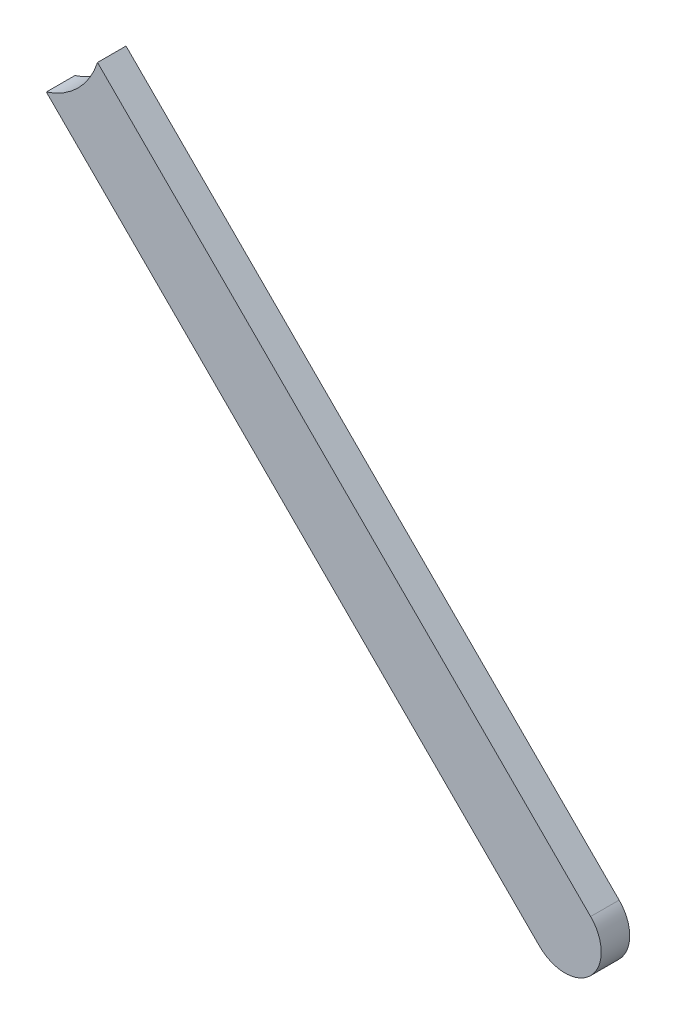
ISO-10303-21;
HEADER;
FILE_DESCRIPTION(('STEP AP214'),'2;1');
FILE_NAME('part.step','',(''),(''),'','','');
FILE_SCHEMA(('AUTOMOTIVE_DESIGN { 1 0 10303 214 1 1 1 1 }'));
ENDSEC;
DATA;
#1=APPLICATION_CONTEXT('core data for automotive mechanical design processes');
#2=APPLICATION_PROTOCOL_DEFINITION('international standard','automotive_design',2000,#1);
#3=PRODUCT_CONTEXT('',#1,'mechanical');
#4=PRODUCT('Part','Part','',(#3));
#5=PRODUCT_RELATED_PRODUCT_CATEGORY('part','',(#4));
#6=PRODUCT_DEFINITION_FORMATION('','',#4);
#7=PRODUCT_DEFINITION_CONTEXT('part definition',#1,'design');
#8=PRODUCT_DEFINITION('design','',#6,#7);
#9=PRODUCT_DEFINITION_SHAPE('','',#8);
#10=(LENGTH_UNIT() NAMED_UNIT(*) SI_UNIT(.MILLI.,.METRE.));
#11=(NAMED_UNIT(*) PLANE_ANGLE_UNIT() SI_UNIT($,.RADIAN.));
#12=(NAMED_UNIT(*) SI_UNIT($,.STERADIAN.) SOLID_ANGLE_UNIT());
#13=UNCERTAINTY_MEASURE_WITH_UNIT(LENGTH_MEASURE(1.E-05),#10,'distance_accuracy_value','');
#14=(GEOMETRIC_REPRESENTATION_CONTEXT(3) GLOBAL_UNCERTAINTY_ASSIGNED_CONTEXT((#13)) GLOBAL_UNIT_ASSIGNED_CONTEXT((#10,
#11,#12)) REPRESENTATION_CONTEXT('',''));
#15=CARTESIAN_POINT('',(0.,0.,0.));
#16=DIRECTION('',(0.,0.,1.));
#17=DIRECTION('',(1.,0.,0.));
#18=AXIS2_PLACEMENT_3D('',#15,#16,#17);
#19=CARTESIAN_POINT('',(133.900327141144,85.3204637788559,0.));
#20=DIRECTION('',(0.707106781186548,0.707106781186548,0.));
#21=DIRECTION('',(0.707106781186548,-0.707106781186548,0.));
#22=AXIS2_PLACEMENT_3D('',#19,#20,#21);
#23=PLANE('',#22);
#24=DIRECTION('',(0.707106781186548,-0.707106781186548,0.));
#25=VECTOR('',#24,1.);
#26=CARTESIAN_POINT('',(133.55139406,85.66939686,0.1999996));
#27=LINE('',#26,#25);
#28=CARTESIAN_POINT('',(133.900327141144,85.3204637788559,0.1999996));
#29=VERTEX_POINT('',#28);
#30=CARTESIAN_POINT('',(137.36139406,81.85939686,0.1999996));
#31=VERTEX_POINT('',#30);
#32=EDGE_CURVE('E11',#29,#31,#27,.T.);
#33=ORIENTED_EDGE('',*,*,#32,.F.);
#34=DIRECTION('',(0.,0.,1.));
#35=VECTOR('',#34,1.);
#36=CARTESIAN_POINT('',(133.900327141144,85.3204637788559,0.));
#37=LINE('',#36,#35);
#38=CARTESIAN_POINT('',(133.900327141144,85.3204637788559,0.));
#39=VERTEX_POINT('',#38);
#40=EDGE_CURVE('E24',#39,#29,#37,.T.);
#41=ORIENTED_EDGE('',*,*,#40,.F.);
#42=DIRECTION('',(0.707106781186548,-0.707106781186548,0.));
#43=VECTOR('',#42,1.);
#44=CARTESIAN_POINT('',(133.55139406,85.66939686,0.));
#45=LINE('',#44,#43);
#46=CARTESIAN_POINT('',(137.36139406,81.85939686,0.));
#47=VERTEX_POINT('',#46);
#48=EDGE_CURVE('E75',#39,#47,#45,.T.);
#49=ORIENTED_EDGE('',*,*,#48,.T.);
#50=DIRECTION('',(0.,0.,1.));
#51=VECTOR('',#50,1.);
#52=CARTESIAN_POINT('',(137.36139406,81.85939686,0.));
#53=LINE('',#52,#51);
#54=EDGE_CURVE('E37',#47,#31,#53,.T.);
#55=ORIENTED_EDGE('',*,*,#54,.T.);
#56=EDGE_LOOP('',(#33,#41,#49,#55));
#57=FACE_BOUND('',#56,.T.);
#58=ADVANCED_FACE('F17',(#57),#23,.F.);
#59=CARTESIAN_POINT('',(137.541,82.0390028,0.));
#60=DIRECTION('',(0.,0.,-1.));
#61=DIRECTION('',(-0.707106781186604,-0.707106781186492,0.));
#62=AXIS2_PLACEMENT_3D('',#59,#60,#61);
#63=CYLINDRICAL_SURFACE('',#62,0.254001156230761);
#64=CARTESIAN_POINT('',(137.541,82.0390028,0.1999996));
#65=DIRECTION('',(0.,0.,1.));
#66=DIRECTION('',(-0.707106781186604,-0.707106781186492,0.));
#67=AXIS2_PLACEMENT_3D('',#64,#65,#66);
#68=CIRCLE('',#67,0.254001156230761);
#69=CARTESIAN_POINT('',(137.72060594,82.21860874,0.1999996));
#70=VERTEX_POINT('',#69);
#71=EDGE_CURVE('E83',#31,#70,#68,.T.);
#72=ORIENTED_EDGE('',*,*,#71,.F.);
#73=ORIENTED_EDGE('',*,*,#54,.F.);
#74=CARTESIAN_POINT('',(137.541,82.0390028,0.));
#75=DIRECTION('',(0.,0.,1.));
#76=DIRECTION('',(-0.707106781186604,-0.707106781186492,0.));
#77=AXIS2_PLACEMENT_3D('',#74,#75,#76);
#78=CIRCLE('',#77,0.254001156230761);
#79=CARTESIAN_POINT('',(137.72060594,82.21860874,0.));
#80=VERTEX_POINT('',#79);
#81=EDGE_CURVE('E81',#47,#80,#78,.T.);
#82=ORIENTED_EDGE('',*,*,#81,.T.);
#83=DIRECTION('',(0.,0.,1.));
#84=VECTOR('',#83,1.);
#85=CARTESIAN_POINT('',(137.72060594,82.21860874,0.));
#86=LINE('',#85,#84);
#87=EDGE_CURVE('E67',#80,#70,#86,.T.);
#88=ORIENTED_EDGE('',*,*,#87,.T.);
#89=EDGE_LOOP('',(#72,#73,#82,#88));
#90=FACE_BOUND('',#89,.T.);
#91=ADVANCED_FACE('F89',(#90),#63,.T.);
#92=CARTESIAN_POINT('',(137.72060594,82.21860874,0.));
#93=DIRECTION('',(-0.707106781186548,-0.707106781186548,0.));
#94=DIRECTION('',(-0.707106781186548,0.707106781186548,0.));
#95=AXIS2_PLACEMENT_3D('',#92,#93,#94);
#96=PLANE('',#95);
#97=DIRECTION('',(-0.707106781186548,0.707106781186548,0.));
#98=VECTOR('',#97,1.);
#99=CARTESIAN_POINT('',(137.72060594,82.21860874,0.1999996));
#100=LINE('',#99,#98);
#101=CARTESIAN_POINT('',(134.259539021144,85.6796756588559,0.1999996));
#102=VERTEX_POINT('',#101);
#103=EDGE_CURVE('E71',#70,#102,#100,.T.);
#104=ORIENTED_EDGE('',*,*,#103,.F.);
#105=ORIENTED_EDGE('',*,*,#87,.F.);
#106=DIRECTION('',(-0.707106781186548,0.707106781186548,0.));
#107=VECTOR('',#106,1.);
#108=CARTESIAN_POINT('',(137.72060594,82.21860874,0.));
#109=LINE('',#108,#107);
#110=CARTESIAN_POINT('',(134.259539021144,85.6796756588559,0.));
#111=VERTEX_POINT('',#110);
#112=EDGE_CURVE('E63',#80,#111,#109,.T.);
#113=ORIENTED_EDGE('',*,*,#112,.T.);
#114=DIRECTION('',(0.,0.,1.));
#115=VECTOR('',#114,1.);
#116=CARTESIAN_POINT('',(134.259539021144,85.6796756588559,0.));
#117=LINE('',#116,#115);
#118=EDGE_CURVE('E53',#111,#102,#117,.T.);
#119=ORIENTED_EDGE('',*,*,#118,.T.);
#120=EDGE_LOOP('',(#104,#105,#113,#119));
#121=FACE_BOUND('',#120,.T.);
#122=ADVANCED_FACE('F66',(#121),#96,.F.);
#123=CARTESIAN_POINT('',(133.731,85.8490028,0.));
#124=DIRECTION('',(0.,0.,-1.));
#125=DIRECTION('',(1.,0.,0.));
#126=AXIS2_PLACEMENT_3D('',#123,#124,#125);
#127=CYLINDRICAL_SURFACE('',#126,0.55500016);
#128=ORIENTED_EDGE('',*,*,#40,.T.);
#129=CARTESIAN_POINT('',(133.731,85.8490028,0.1999996));
#130=DIRECTION('',(0.,0.,1.));
#131=DIRECTION('',(1.,0.,0.));
#132=AXIS2_PLACEMENT_3D('',#129,#130,#131);
#133=CIRCLE('',#132,0.55500016);
#134=EDGE_CURVE('E59',#29,#102,#133,.T.);
#135=ORIENTED_EDGE('',*,*,#134,.T.);
#136=ORIENTED_EDGE('',*,*,#118,.F.);
#137=CARTESIAN_POINT('',(133.731,85.8490028,0.));
#138=DIRECTION('',(0.,0.,1.));
#139=DIRECTION('',(1.,0.,0.));
#140=AXIS2_PLACEMENT_3D('',#137,#138,#139);
#141=CIRCLE('',#140,0.55500016);
#142=EDGE_CURVE('E57',#39,#111,#141,.T.);
#143=ORIENTED_EDGE('',*,*,#142,.F.);
#144=EDGE_LOOP('',(#128,#135,#136,#143));
#145=FACE_BOUND('',#144,.T.);
#146=ADVANCED_FACE('F55',(#145),#127,.F.);
#147=CARTESIAN_POINT('',(133.55139406,85.66939686,0.));
#148=DIRECTION('',(0.,0.,-1.));
#149=DIRECTION('',(-1.,0.,0.));
#150=AXIS2_PLACEMENT_3D('',#147,#148,#149);
#151=PLANE('',#150);
#152=ORIENTED_EDGE('',*,*,#48,.F.);
#153=ORIENTED_EDGE('',*,*,#142,.T.);
#154=ORIENTED_EDGE('',*,*,#112,.F.);
#155=ORIENTED_EDGE('',*,*,#81,.F.);
#156=EDGE_LOOP('',(#152,#153,#154,#155));
#157=FACE_BOUND('',#156,.T.);
#158=ADVANCED_FACE('F74',(#157),#151,.T.);
#159=CARTESIAN_POINT('',(133.55139406,85.66939686,0.1999996));
#160=DIRECTION('',(0.,0.,-1.));
#161=DIRECTION('',(-1.,0.,0.));
#162=AXIS2_PLACEMENT_3D('',#159,#160,#161);
#163=PLANE('',#162);
#164=ORIENTED_EDGE('',*,*,#134,.F.);
#165=ORIENTED_EDGE('',*,*,#32,.T.);
#166=ORIENTED_EDGE('',*,*,#71,.T.);
#167=ORIENTED_EDGE('',*,*,#103,.T.);
#168=EDGE_LOOP('',(#164,#165,#166,#167));
#169=FACE_BOUND('',#168,.T.);
#170=ADVANCED_FACE('F91',(#169),#163,.F.);
#171=CLOSED_SHELL('',(#58,#91,#122,#146,#158,#170));
#172=MANIFOLD_SOLID_BREP('B1',#171);
#173=ADVANCED_BREP_SHAPE_REPRESENTATION('',(#18,#172),#14);
#174=SHAPE_DEFINITION_REPRESENTATION(#9,#173);
ENDSEC;
END-ISO-10303-21;
